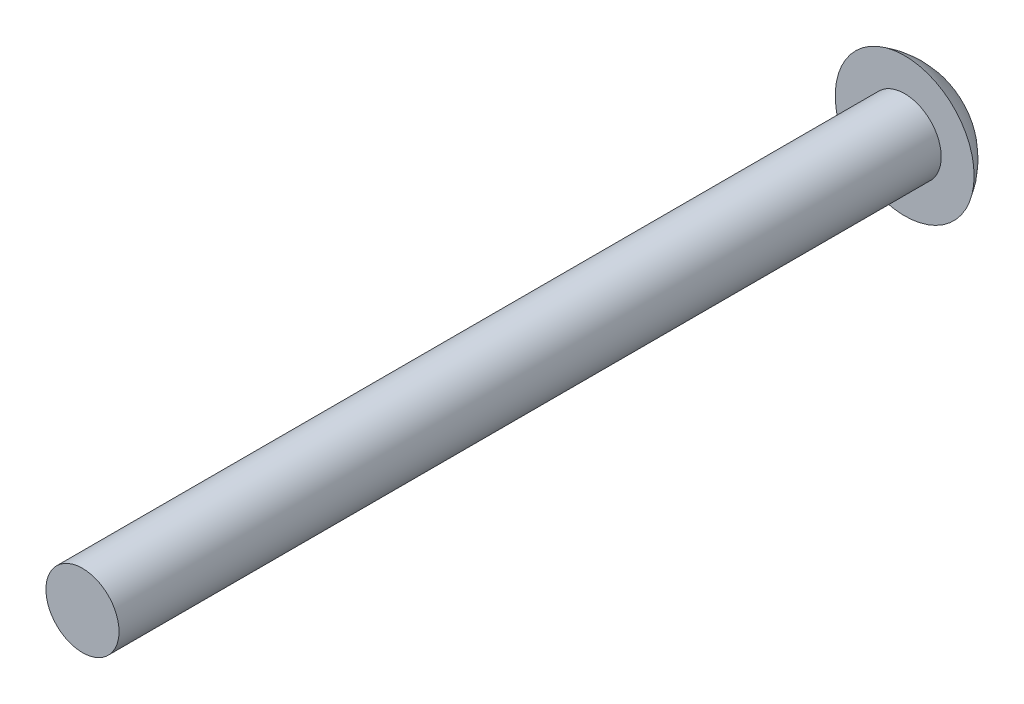
ISO-10303-21;
HEADER;
FILE_DESCRIPTION(('STEP AP214'),'2;1');
FILE_NAME('part.step','',(''),(''),'','','');
FILE_SCHEMA(('AUTOMOTIVE_DESIGN { 1 0 10303 214 1 1 1 1 }'));
ENDSEC;
DATA;
#1=APPLICATION_CONTEXT('core data for automotive mechanical design processes');
#2=APPLICATION_PROTOCOL_DEFINITION('international standard','automotive_design',2000,#1);
#3=PRODUCT_CONTEXT('',#1,'mechanical');
#4=PRODUCT('Part','Part','',(#3));
#5=PRODUCT_RELATED_PRODUCT_CATEGORY('part','',(#4));
#6=PRODUCT_DEFINITION_FORMATION('','',#4);
#7=PRODUCT_DEFINITION_CONTEXT('part definition',#1,'design');
#8=PRODUCT_DEFINITION('design','',#6,#7);
#9=PRODUCT_DEFINITION_SHAPE('','',#8);
#10=(LENGTH_UNIT() NAMED_UNIT(*) SI_UNIT(.MILLI.,.METRE.));
#11=(NAMED_UNIT(*) PLANE_ANGLE_UNIT() SI_UNIT($,.RADIAN.));
#12=(NAMED_UNIT(*) SI_UNIT($,.STERADIAN.) SOLID_ANGLE_UNIT());
#13=UNCERTAINTY_MEASURE_WITH_UNIT(LENGTH_MEASURE(1.E-05),#10,'distance_accuracy_value','');
#14=(GEOMETRIC_REPRESENTATION_CONTEXT(3) GLOBAL_UNCERTAINTY_ASSIGNED_CONTEXT((#13)) GLOBAL_UNIT_ASSIGNED_CONTEXT((#10,
#11,#12)) REPRESENTATION_CONTEXT('',''));
#15=CARTESIAN_POINT('',(0.,0.,0.));
#16=DIRECTION('',(0.,0.,1.));
#17=DIRECTION('',(1.,0.,0.));
#18=AXIS2_PLACEMENT_3D('',#15,#16,#17);
#19=CARTESIAN_POINT('',(0.,0.,25.1));
#20=DIRECTION('',(0.,0.,1.));
#21=DIRECTION('',(1.,0.,0.));
#22=AXIS2_PLACEMENT_3D('',#19,#20,#21);
#23=PLANE('',#22);
#24=DIRECTION('',(0.50000000000019,0.866025403784329,0.));
#25=VECTOR('',#24,1.);
#26=CARTESIAN_POINT('',(0.721687836487,-1.25,25.1));
#27=LINE('',#26,#25);
#28=CARTESIAN_POINT('',(0.721687836487,-1.25,25.1));
#29=VERTEX_POINT('',#28);
#30=CARTESIAN_POINT('',(1.443375672974,0.,25.1));
#31=VERTEX_POINT('',#30);
#32=EDGE_CURVE('E87',#29,#31,#27,.T.);
#33=ORIENTED_EDGE('',*,*,#32,.F.);
#34=DIRECTION('',(1.,0.,0.));
#35=VECTOR('',#34,1.);
#36=CARTESIAN_POINT('',(-0.721687836487,-1.25,25.1));
#37=LINE('',#36,#35);
#38=CARTESIAN_POINT('',(-0.721687836487,-1.25,25.1));
#39=VERTEX_POINT('',#38);
#40=EDGE_CURVE('E158',#39,#29,#37,.T.);
#41=ORIENTED_EDGE('',*,*,#40,.F.);
#42=DIRECTION('',(0.50000000000019,-0.866025403784329,0.));
#43=VECTOR('',#42,1.);
#44=CARTESIAN_POINT('',(-1.443375672974,0.,25.1));
#45=LINE('',#44,#43);
#46=CARTESIAN_POINT('',(-1.443375672974,0.,25.1));
#47=VERTEX_POINT('',#46);
#48=EDGE_CURVE('E146',#47,#39,#45,.T.);
#49=ORIENTED_EDGE('',*,*,#48,.F.);
#50=DIRECTION('',(-0.50000000000019,-0.866025403784329,0.));
#51=VECTOR('',#50,1.);
#52=CARTESIAN_POINT('',(-0.721687836487,1.25,25.1));
#53=LINE('',#52,#51);
#54=CARTESIAN_POINT('',(-0.721687836487,1.25,25.1));
#55=VERTEX_POINT('',#54);
#56=EDGE_CURVE('E154',#55,#47,#53,.T.);
#57=ORIENTED_EDGE('',*,*,#56,.F.);
#58=DIRECTION('',(-1.,0.,0.));
#59=VECTOR('',#58,1.);
#60=CARTESIAN_POINT('',(0.721687836487,1.25,25.1));
#61=LINE('',#60,#59);
#62=CARTESIAN_POINT('',(0.721687836487,1.25,25.1));
#63=VERTEX_POINT('',#62);
#64=EDGE_CURVE('E26',#63,#55,#61,.T.);
#65=ORIENTED_EDGE('',*,*,#64,.F.);
#66=DIRECTION('',(-0.50000000000019,0.866025403784329,0.));
#67=VECTOR('',#66,1.);
#68=CARTESIAN_POINT('',(1.443375672974,0.,25.1));
#69=LINE('',#68,#67);
#70=EDGE_CURVE('E10',#31,#63,#69,.T.);
#71=ORIENTED_EDGE('',*,*,#70,.F.);
#72=EDGE_LOOP('',(#33,#41,#49,#57,#65,#71));
#73=FACE_BOUND('',#72,.T.);
#74=ADVANCED_FACE('F15',(#73),#23,.F.);
#75=CARTESIAN_POINT('',(0.,0.,71.2));
#76=DIRECTION('',(0.,0.,1.));
#77=DIRECTION('',(1.,0.,0.));
#78=AXIS2_PLACEMENT_3D('',#75,#76,#77);
#79=PLANE('',#78);
#80=CARTESIAN_POINT('',(0.,0.,71.2));
#81=DIRECTION('',(0.,0.,1.));
#82=DIRECTION('',(1.,0.,0.));
#83=AXIS2_PLACEMENT_3D('',#80,#81,#82);
#84=CIRCLE('',#83,2.);
#85=CARTESIAN_POINT('',(2.,0.,71.2));
#86=VERTEX_POINT('',#85);
#87=EDGE_CURVE('E102',#86,#86,#84,.T.);
#88=ORIENTED_EDGE('',*,*,#87,.T.);
#89=EDGE_LOOP('',(#88));
#90=FACE_BOUND('',#89,.T.);
#91=ADVANCED_FACE('F284',(#90),#79,.T.);
#92=CARTESIAN_POINT('',(1.443375672974,0.,23.9));
#93=DIRECTION('',(-0.866025403784329,-0.50000000000019,0.));
#94=DIRECTION('',(-0.50000000000019,0.866025403784329,0.));
#95=AXIS2_PLACEMENT_3D('',#92,#93,#94);
#96=PLANE('',#95);
#97=CARTESIAN_POINT('',(1.082531754731,0.625,28.381818181818));
#98=DIRECTION('',(-0.866025403784329,-0.50000000000019,0.));
#99=DIRECTION('',(0.50000000000019,-0.866025403784329,0.));
#100=AXIS2_PLACEMENT_3D('',#97,#98,#99);
#101=CIRCLE('',#100,4.199741727596);
#102=CARTESIAN_POINT('',(0.721687836487,1.25,24.244548883697));
#103=VERTEX_POINT('',#102);
#104=CARTESIAN_POINT('',(1.443375672974,0.,24.244548883697));
#105=VERTEX_POINT('',#104);
#106=EDGE_CURVE('E105',#103,#105,#101,.T.);
#107=ORIENTED_EDGE('',*,*,#106,.T.);
#108=DIRECTION('',(0.,0.,1.));
#109=VECTOR('',#108,1.);
#110=CARTESIAN_POINT('',(1.443375672974,0.,23.9));
#111=LINE('',#110,#109);
#112=EDGE_CURVE('E79',#105,#31,#111,.T.);
#113=ORIENTED_EDGE('',*,*,#112,.T.);
#114=ORIENTED_EDGE('',*,*,#70,.T.);
#115=DIRECTION('',(0.,0.,1.));
#116=VECTOR('',#115,1.);
#117=CARTESIAN_POINT('',(0.721687836487,1.25,23.9));
#118=LINE('',#117,#116);
#119=EDGE_CURVE('E19',#103,#63,#118,.T.);
#120=ORIENTED_EDGE('',*,*,#119,.F.);
#121=EDGE_LOOP('',(#107,#113,#114,#120));
#122=FACE_BOUND('',#121,.T.);
#123=ADVANCED_FACE('F106',(#122),#96,.T.);
#124=CARTESIAN_POINT('',(0.721687836487,1.25,23.9));
#125=DIRECTION('',(0.,-1.,0.));
#126=DIRECTION('',(-1.,0.,0.));
#127=AXIS2_PLACEMENT_3D('',#124,#125,#126);
#128=PLANE('',#127);
#129=CARTESIAN_POINT('',(0.,1.25,28.381818181818));
#130=DIRECTION('',(0.,-1.,0.));
#131=DIRECTION('',(1.,0.,0.));
#132=AXIS2_PLACEMENT_3D('',#129,#130,#131);
#133=CIRCLE('',#132,4.199741727596);
#134=CARTESIAN_POINT('',(-0.721687836487,1.25,24.244548883697));
#135=VERTEX_POINT('',#134);
#136=EDGE_CURVE('E109',#135,#103,#133,.T.);
#137=ORIENTED_EDGE('',*,*,#136,.T.);
#138=ORIENTED_EDGE('',*,*,#119,.T.);
#139=ORIENTED_EDGE('',*,*,#64,.T.);
#140=DIRECTION('',(0.,0.,1.));
#141=VECTOR('',#140,1.);
#142=CARTESIAN_POINT('',(-0.721687836487,1.25,23.9));
#143=LINE('',#142,#141);
#144=EDGE_CURVE('E150',#135,#55,#143,.T.);
#145=ORIENTED_EDGE('',*,*,#144,.F.);
#146=EDGE_LOOP('',(#137,#138,#139,#145));
#147=FACE_BOUND('',#146,.T.);
#148=ADVANCED_FACE('F228',(#147),#128,.T.);
#149=CARTESIAN_POINT('',(-0.721687836487,1.25,23.9));
#150=DIRECTION('',(0.866025403784329,-0.50000000000019,0.));
#151=DIRECTION('',(0.,0.,-1.));
#152=AXIS2_PLACEMENT_3D('',#149,#150,#151);
#153=PLANE('',#152);
#154=CARTESIAN_POINT('',(-1.082531754731,0.625,28.381818181818));
#155=DIRECTION('',(0.866025403784329,-0.50000000000019,0.));
#156=DIRECTION('',(0.50000000000019,0.866025403784329,0.));
#157=AXIS2_PLACEMENT_3D('',#154,#155,#156);
#158=CIRCLE('',#157,4.199741727596);
#159=CARTESIAN_POINT('',(-1.443375672974,0.,24.244548883697));
#160=VERTEX_POINT('',#159);
#161=EDGE_CURVE('E125',#160,#135,#158,.T.);
#162=ORIENTED_EDGE('',*,*,#161,.T.);
#163=ORIENTED_EDGE('',*,*,#144,.T.);
#164=ORIENTED_EDGE('',*,*,#56,.T.);
#165=DIRECTION('',(0.,0.,1.));
#166=VECTOR('',#165,1.);
#167=CARTESIAN_POINT('',(-1.443375672974,0.,23.9));
#168=LINE('',#167,#166);
#169=EDGE_CURVE('E151',#160,#47,#168,.T.);
#170=ORIENTED_EDGE('',*,*,#169,.F.);
#171=EDGE_LOOP('',(#162,#163,#164,#170));
#172=FACE_BOUND('',#171,.T.);
#173=ADVANCED_FACE('F223',(#172),#153,.T.);
#174=CARTESIAN_POINT('',(-1.443375672974,0.,23.9));
#175=DIRECTION('',(0.866025403784329,0.50000000000019,0.));
#176=DIRECTION('',(0.,0.,-1.));
#177=AXIS2_PLACEMENT_3D('',#174,#175,#176);
#178=PLANE('',#177);
#179=CARTESIAN_POINT('',(-1.082531754731,-0.625,28.381818181818));
#180=DIRECTION('',(0.866025403784329,0.50000000000019,0.));
#181=DIRECTION('',(-0.50000000000019,0.866025403784329,0.));
#182=AXIS2_PLACEMENT_3D('',#179,#180,#181);
#183=CIRCLE('',#182,4.199741727596);
#184=CARTESIAN_POINT('',(-0.721687836487,-1.25,24.244548883697));
#185=VERTEX_POINT('',#184);
#186=EDGE_CURVE('E123',#185,#160,#183,.T.);
#187=ORIENTED_EDGE('',*,*,#186,.T.);
#188=ORIENTED_EDGE('',*,*,#169,.T.);
#189=ORIENTED_EDGE('',*,*,#48,.T.);
#190=DIRECTION('',(0.,0.,1.));
#191=VECTOR('',#190,1.);
#192=CARTESIAN_POINT('',(-0.721687836487,-1.25,23.9));
#193=LINE('',#192,#191);
#194=EDGE_CURVE('E89',#185,#39,#193,.T.);
#195=ORIENTED_EDGE('',*,*,#194,.F.);
#196=EDGE_LOOP('',(#187,#188,#189,#195));
#197=FACE_BOUND('',#196,.T.);
#198=ADVANCED_FACE('F186',(#197),#178,.T.);
#199=CARTESIAN_POINT('',(-0.721687836487,-1.25,23.9));
#200=DIRECTION('',(0.,1.,0.));
#201=DIRECTION('',(1.,0.,0.));
#202=AXIS2_PLACEMENT_3D('',#199,#200,#201);
#203=PLANE('',#202);
#204=CARTESIAN_POINT('',(0.,-1.25,28.381818181818));
#205=DIRECTION('',(0.,1.,0.));
#206=DIRECTION('',(-1.,0.,0.));
#207=AXIS2_PLACEMENT_3D('',#204,#205,#206);
#208=CIRCLE('',#207,4.199741727596);
#209=CARTESIAN_POINT('',(0.721687836487,-1.25,24.244548883697));
#210=VERTEX_POINT('',#209);
#211=EDGE_CURVE('E100',#210,#185,#208,.T.);
#212=ORIENTED_EDGE('',*,*,#211,.T.);
#213=ORIENTED_EDGE('',*,*,#194,.T.);
#214=ORIENTED_EDGE('',*,*,#40,.T.);
#215=DIRECTION('',(0.,0.,1.));
#216=VECTOR('',#215,1.);
#217=CARTESIAN_POINT('',(0.721687836487,-1.25,23.9));
#218=LINE('',#217,#216);
#219=EDGE_CURVE('E145',#210,#29,#218,.T.);
#220=ORIENTED_EDGE('',*,*,#219,.F.);
#221=EDGE_LOOP('',(#212,#213,#214,#220));
#222=FACE_BOUND('',#221,.T.);
#223=ADVANCED_FACE('F181',(#222),#203,.T.);
#224=CARTESIAN_POINT('',(0.721687836487,-1.25,23.9));
#225=DIRECTION('',(-0.866025403784329,0.50000000000019,0.));
#226=DIRECTION('',(0.,0.,1.));
#227=AXIS2_PLACEMENT_3D('',#224,#225,#226);
#228=PLANE('',#227);
#229=CARTESIAN_POINT('',(1.082531754731,-0.625,28.381818181818));
#230=DIRECTION('',(-0.866025403784329,0.50000000000019,0.));
#231=DIRECTION('',(-0.50000000000019,-0.866025403784329,0.));
#232=AXIS2_PLACEMENT_3D('',#229,#230,#231);
#233=CIRCLE('',#232,4.199741727596);
#234=EDGE_CURVE('E83',#105,#210,#233,.T.);
#235=ORIENTED_EDGE('',*,*,#234,.T.);
#236=ORIENTED_EDGE('',*,*,#219,.T.);
#237=ORIENTED_EDGE('',*,*,#32,.T.);
#238=ORIENTED_EDGE('',*,*,#112,.F.);
#239=EDGE_LOOP('',(#235,#236,#237,#238));
#240=FACE_BOUND('',#239,.T.);
#241=ADVANCED_FACE('F81',(#240),#228,.T.);
#242=CARTESIAN_POINT('',(0.,0.,26.2));
#243=DIRECTION('',(0.,0.,1.));
#244=DIRECTION('',(1.,0.,0.));
#245=AXIS2_PLACEMENT_3D('',#242,#243,#244);
#246=CYLINDRICAL_SURFACE('',#245,2.);
#247=ORIENTED_EDGE('',*,*,#87,.F.);
#248=DIRECTION('',(0.,0.,1.));
#249=VECTOR('',#248,1.);
#250=CARTESIAN_POINT('',(2.,0.,26.2));
#251=LINE('',#250,#249);
#252=CARTESIAN_POINT('',(2.,0.,26.2));
#253=VERTEX_POINT('',#252);
#254=EDGE_CURVE('E160',#253,#86,#251,.T.);
#255=ORIENTED_EDGE('',*,*,#254,.F.);
#256=CARTESIAN_POINT('',(0.,0.,26.2));
#257=DIRECTION('',(0.,0.,1.));
#258=DIRECTION('',(1.,0.,0.));
#259=AXIS2_PLACEMENT_3D('',#256,#257,#258);
#260=CIRCLE('',#259,2.);
#261=EDGE_CURVE('E113',#253,#253,#260,.T.);
#262=ORIENTED_EDGE('',*,*,#261,.T.);
#263=ORIENTED_EDGE('',*,*,#254,.T.);
#264=EDGE_LOOP('',(#247,#255,#262,#263));
#265=FACE_BOUND('',#264,.T.);
#266=ADVANCED_FACE('F17',(#265),#246,.T.);
#267=CARTESIAN_POINT('',(0.,0.,28.381818181818));
#268=DIRECTION('',(0.,0.,1.));
#269=DIRECTION('',(1.,0.,0.));
#270=AXIS2_PLACEMENT_3D('',#267,#268,#269);
#271=SPHERICAL_SURFACE('',#270,4.381818181818);
#272=CARTESIAN_POINT('',(0.,0.,28.381818181818));
#273=DIRECTION('',(0.,-1.,0.));
#274=DIRECTION('',(1.,0.,0.));
#275=AXIS2_PLACEMENT_3D('',#272,#273,#274);
#276=CIRCLE('',#275,4.381818181818);
#277=CARTESIAN_POINT('',(3.8,0.,26.2));
#278=VERTEX_POINT('',#277);
#279=EDGE_CURVE('E96',#105,#278,#276,.T.);
#280=ORIENTED_EDGE('',*,*,#279,.T.);
#281=CARTESIAN_POINT('',(0.,0.,26.2));
#282=DIRECTION('',(0.,0.,1.));
#283=DIRECTION('',(1.,0.,0.));
#284=AXIS2_PLACEMENT_3D('',#281,#282,#283);
#285=CIRCLE('',#284,3.8);
#286=EDGE_CURVE('E111',#278,#278,#285,.T.);
#287=ORIENTED_EDGE('',*,*,#286,.F.);
#288=ORIENTED_EDGE('',*,*,#279,.F.);
#289=ORIENTED_EDGE('',*,*,#106,.F.);
#290=ORIENTED_EDGE('',*,*,#136,.F.);
#291=ORIENTED_EDGE('',*,*,#161,.F.);
#292=ORIENTED_EDGE('',*,*,#186,.F.);
#293=ORIENTED_EDGE('',*,*,#211,.F.);
#294=ORIENTED_EDGE('',*,*,#234,.F.);
#295=EDGE_LOOP('',(#280,#287,#288,#289,#290,#291,#292,#293,#294));
#296=FACE_BOUND('',#295,.T.);
#297=ADVANCED_FACE('F93',(#296),#271,.T.);
#298=CARTESIAN_POINT('',(0.,0.,26.2));
#299=DIRECTION('',(0.,0.,1.));
#300=DIRECTION('',(1.,0.,0.));
#301=AXIS2_PLACEMENT_3D('',#298,#299,#300);
#302=PLANE('',#301);
#303=ORIENTED_EDGE('',*,*,#261,.F.);
#304=EDGE_LOOP('',(#303));
#305=FACE_BOUND('',#304,.T.);
#306=ORIENTED_EDGE('',*,*,#286,.T.);
#307=EDGE_LOOP('',(#306));
#308=FACE_BOUND('',#307,.T.);
#309=ADVANCED_FACE('F244',(#305,#308),#302,.T.);
#310=CLOSED_SHELL('',(#74,#91,#123,#148,#173,#198,#223,#241,#266,#297,#309));
#311=MANIFOLD_SOLID_BREP('B1',#310);
#312=ADVANCED_BREP_SHAPE_REPRESENTATION('',(#18,#311),#14);
#313=SHAPE_DEFINITION_REPRESENTATION(#9,#312);
ENDSEC;
END-ISO-10303-21;
